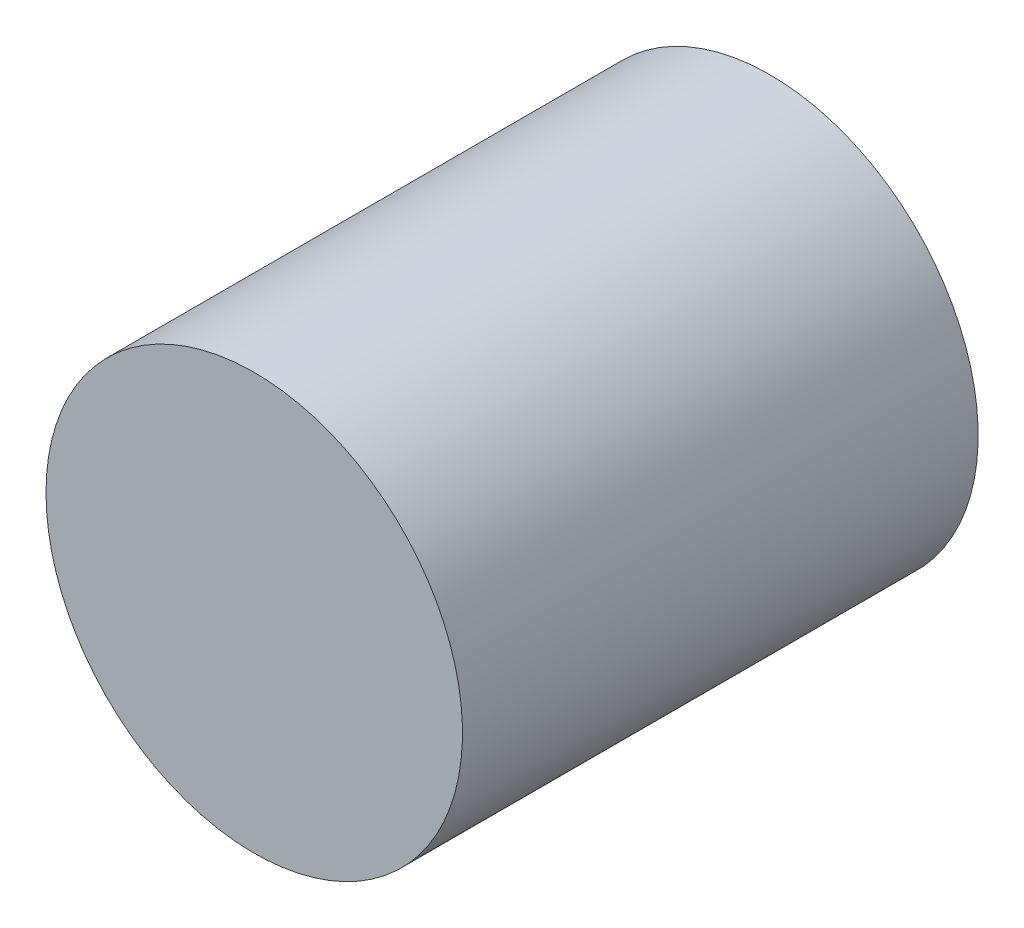
ISO-10303-21;
HEADER;
FILE_DESCRIPTION(('STEP AP214'),'2;1');
FILE_NAME('part.step','',(''),(''),'','','');
FILE_SCHEMA(('AUTOMOTIVE_DESIGN { 1 0 10303 214 1 1 1 1 }'));
ENDSEC;
DATA;
#1=APPLICATION_CONTEXT('core data for automotive mechanical design processes');
#2=APPLICATION_PROTOCOL_DEFINITION('international standard','automotive_design',2000,#1);
#3=PRODUCT_CONTEXT('',#1,'mechanical');
#4=PRODUCT('Part','Part','',(#3));
#5=PRODUCT_RELATED_PRODUCT_CATEGORY('part','',(#4));
#6=PRODUCT_DEFINITION_FORMATION('','',#4);
#7=PRODUCT_DEFINITION_CONTEXT('part definition',#1,'design');
#8=PRODUCT_DEFINITION('design','',#6,#7);
#9=PRODUCT_DEFINITION_SHAPE('','',#8);
#10=(LENGTH_UNIT() NAMED_UNIT(*) SI_UNIT(.MILLI.,.METRE.));
#11=(NAMED_UNIT(*) PLANE_ANGLE_UNIT() SI_UNIT($,.RADIAN.));
#12=(NAMED_UNIT(*) SI_UNIT($,.STERADIAN.) SOLID_ANGLE_UNIT());
#13=UNCERTAINTY_MEASURE_WITH_UNIT(LENGTH_MEASURE(1.E-05),#10,'distance_accuracy_value','');
#14=(GEOMETRIC_REPRESENTATION_CONTEXT(3) GLOBAL_UNCERTAINTY_ASSIGNED_CONTEXT((#13)) GLOBAL_UNIT_ASSIGNED_CONTEXT((#10,
#11,#12)) REPRESENTATION_CONTEXT('',''));
#15=CARTESIAN_POINT('',(0.,0.,0.));
#16=DIRECTION('',(0.,0.,1.));
#17=DIRECTION('',(1.,0.,0.));
#18=AXIS2_PLACEMENT_3D('',#15,#16,#17);
#19=CARTESIAN_POINT('',(0.,0.,52.));
#20=DIRECTION('',(0.,0.,-1.));
#21=DIRECTION('',(-1.,0.,0.));
#22=AXIS2_PLACEMENT_3D('',#19,#20,#21);
#23=CYLINDRICAL_SURFACE('',#22,21.);
#24=CARTESIAN_POINT('',(0.,0.,52.));
#25=DIRECTION('',(0.,0.,1.));
#26=DIRECTION('',(1.,0.,0.));
#27=AXIS2_PLACEMENT_3D('',#24,#25,#26);
#28=CIRCLE('',#27,21.);
#29=CARTESIAN_POINT('',(-21.,0.,52.));
#30=VERTEX_POINT('',#29);
#31=EDGE_CURVE('E10',#30,#30,#28,.T.);
#32=CARTESIAN_POINT('',(0.,0.,0.));
#33=DIRECTION('',(0.,0.,1.));
#34=DIRECTION('',(1.,0.,0.));
#35=AXIS2_PLACEMENT_3D('',#32,#33,#34);
#36=CIRCLE('',#35,21.);
#37=CARTESIAN_POINT('',(-21.,0.,0.));
#38=VERTEX_POINT('',#37);
#39=EDGE_CURVE('E37',#38,#38,#36,.T.);
#40=CARTESIAN_POINT('',(-21.,0.,52.));
#41=CARTESIAN_POINT('',(-21.,0.,51.4583333333333));
#42=CARTESIAN_POINT('',(-21.,0.,50.9166666666667));
#43=CARTESIAN_POINT('',(-21.,0.,49.8333333333333));
#44=CARTESIAN_POINT('',(-21.,0.,49.2916666666667));
#45=CARTESIAN_POINT('',(-21.,0.,48.2083333333333));
#46=CARTESIAN_POINT('',(-21.,0.,47.6666666666667));
#47=CARTESIAN_POINT('',(-21.,0.,46.5833333333333));
#48=CARTESIAN_POINT('',(-21.,0.,46.0416666666667));
#49=CARTESIAN_POINT('',(-21.,0.,44.9583333333333));
#50=CARTESIAN_POINT('',(-21.,0.,44.4166666666667));
#51=CARTESIAN_POINT('',(-21.,0.,43.3333333333333));
#52=CARTESIAN_POINT('',(-21.,0.,42.7916666666667));
#53=CARTESIAN_POINT('',(-21.,0.,41.7083333333333));
#54=CARTESIAN_POINT('',(-21.,0.,41.1666666666667));
#55=CARTESIAN_POINT('',(-21.,0.,40.0833333333333));
#56=CARTESIAN_POINT('',(-21.,0.,39.5416666666667));
#57=CARTESIAN_POINT('',(-21.,0.,38.4583333333333));
#58=CARTESIAN_POINT('',(-21.,0.,37.9166666666667));
#59=CARTESIAN_POINT('',(-21.,0.,36.8333333333333));
#60=CARTESIAN_POINT('',(-21.,0.,36.2916666666667));
#61=CARTESIAN_POINT('',(-21.,0.,35.2083333333333));
#62=CARTESIAN_POINT('',(-21.,0.,34.6666666666667));
#63=CARTESIAN_POINT('',(-21.,0.,33.5833333333333));
#64=CARTESIAN_POINT('',(-21.,0.,33.0416666666667));
#65=CARTESIAN_POINT('',(-21.,0.,31.9583333333333));
#66=CARTESIAN_POINT('',(-21.,0.,31.4166666666667));
#67=CARTESIAN_POINT('',(-21.,0.,30.3333333333333));
#68=CARTESIAN_POINT('',(-21.,0.,29.7916666666667));
#69=CARTESIAN_POINT('',(-21.,0.,28.7083333333333));
#70=CARTESIAN_POINT('',(-21.,0.,28.1666666666667));
#71=CARTESIAN_POINT('',(-21.,0.,27.0833333333333));
#72=CARTESIAN_POINT('',(-21.,0.,26.5416666666667));
#73=CARTESIAN_POINT('',(-21.,0.,25.4583333333333));
#74=CARTESIAN_POINT('',(-21.,0.,24.9166666666667));
#75=CARTESIAN_POINT('',(-21.,0.,23.8333333333333));
#76=CARTESIAN_POINT('',(-21.,0.,23.2916666666667));
#77=CARTESIAN_POINT('',(-21.,0.,22.2083333333333));
#78=CARTESIAN_POINT('',(-21.,0.,21.6666666666667));
#79=CARTESIAN_POINT('',(-21.,0.,20.5833333333333));
#80=CARTESIAN_POINT('',(-21.,0.,20.0416666666667));
#81=CARTESIAN_POINT('',(-21.,0.,18.9583333333333));
#82=CARTESIAN_POINT('',(-21.,0.,18.4166666666667));
#83=CARTESIAN_POINT('',(-21.,0.,17.3333333333333));
#84=CARTESIAN_POINT('',(-21.,0.,16.7916666666667));
#85=CARTESIAN_POINT('',(-21.,0.,15.7083333333333));
#86=CARTESIAN_POINT('',(-21.,0.,15.1666666666667));
#87=CARTESIAN_POINT('',(-21.,0.,14.0833333333333));
#88=CARTESIAN_POINT('',(-21.,0.,13.5416666666667));
#89=CARTESIAN_POINT('',(-21.,0.,12.4583333333333));
#90=CARTESIAN_POINT('',(-21.,0.,11.9166666666667));
#91=CARTESIAN_POINT('',(-21.,0.,10.8333333333333));
#92=CARTESIAN_POINT('',(-21.,0.,10.2916666666667));
#93=CARTESIAN_POINT('',(-21.,0.,9.20833333333333));
#94=CARTESIAN_POINT('',(-21.,0.,8.66666666666667));
#95=CARTESIAN_POINT('',(-21.,0.,7.58333333333333));
#96=CARTESIAN_POINT('',(-21.,0.,7.04166666666667));
#97=CARTESIAN_POINT('',(-21.,0.,5.95833333333333));
#98=CARTESIAN_POINT('',(-21.,0.,5.41666666666667));
#99=CARTESIAN_POINT('',(-21.,0.,4.33333333333333));
#100=CARTESIAN_POINT('',(-21.,0.,3.79166666666667));
#101=CARTESIAN_POINT('',(-21.,0.,2.70833333333334));
#102=CARTESIAN_POINT('',(-21.,0.,2.16666666666667));
#103=CARTESIAN_POINT('',(-21.,0.,1.08333333333333));
#104=CARTESIAN_POINT('',(-21.,0.,0.541666666666667));
#105=CARTESIAN_POINT('',(-21.,0.,0.));
#106=B_SPLINE_CURVE_WITH_KNOTS('',3,(#40,#41,#42,#43,#44,#45,#46,#47,#48,#49,#50,#51,#52,#53,
#54,#55,#56,#57,#58,#59,#60,#61,#62,#63,#64,#65,#66,#67,#68,#69,#70,#71,#72,#73,#74,#75,#76,#77,
#78,#79,#80,#81,#82,#83,#84,#85,#86,#87,#88,#89,#90,#91,#92,#93,#94,#95,#96,#97,#98,#99,#100,
#101,#102,#103,#104,#105),.UNSPECIFIED.,.F.,.F.,(4,2,2,2,2,2,2,2,2,2,2,2,2,2,2,2,2,2,2,2,2,2,2,
2,2,2,2,2,2,2,2,2,4),(0.,1.625,3.25,4.875,6.50000000000001,8.125,9.75,11.375,13.,14.625,16.25,
17.875,19.5,21.125,22.75,24.375,26.,27.625,29.25,30.875,32.5,34.125,35.75,37.375,39.,40.625,
42.25,43.875,45.5,47.125,48.75,50.375,52.),.UNSPECIFIED.);
#107=EDGE_CURVE('BSEAM34',#30,#38,#106,.T.);
#108=ORIENTED_EDGE('',*,*,#31,.F.);
#109=ORIENTED_EDGE('',*,*,#39,.T.);
#110=ORIENTED_EDGE('',*,*,#107,.T.);
#111=ORIENTED_EDGE('',*,*,#107,.F.);
#112=EDGE_LOOP('',(#108,#110,#109,#111));
#113=FACE_BOUND('',#112,.T.);
#114=ADVANCED_FACE('F34',(#113),#23,.T.);
#115=CARTESIAN_POINT('',(0.,0.,52.));
#116=DIRECTION('',(0.,0.,1.));
#117=DIRECTION('',(1.,0.,0.));
#118=AXIS2_PLACEMENT_3D('',#115,#116,#117);
#119=PLANE('',#118);
#120=ORIENTED_EDGE('',*,*,#31,.T.);
#121=EDGE_LOOP('',(#120));
#122=FACE_BOUND('',#121,.T.);
#123=ADVANCED_FACE('F76',(#122),#119,.T.);
#124=CARTESIAN_POINT('',(0.,0.,0.));
#125=DIRECTION('',(0.,0.,1.));
#126=DIRECTION('',(1.,0.,0.));
#127=AXIS2_PLACEMENT_3D('',#124,#125,#126);
#128=PLANE('',#127);
#129=CARTESIAN_POINT('',(-12.3408620039273,-7.12500000000053,0.));
#130=DIRECTION('',(0.,0.,1.));
#131=DIRECTION('',(1.,0.,0.));
#132=AXIS2_PLACEMENT_3D('',#129,#130,#131);
#133=CIRCLE('',#132,2.00000000000115);
#134=CARTESIAN_POINT('',(-10.3408620039262,-7.12500000000053,0.));
#135=VERTEX_POINT('',#134);
#136=EDGE_CURVE('E58',#135,#135,#133,.T.);
#137=ORIENTED_EDGE('',*,*,#136,.T.);
#138=EDGE_LOOP('',(#137));
#139=FACE_BOUND('',#138,.T.);
#140=CARTESIAN_POINT('',(12.3408620039292,-7.12499999999948,0.));
#141=DIRECTION('',(0.,0.,1.));
#142=DIRECTION('',(1.,0.,0.));
#143=AXIS2_PLACEMENT_3D('',#140,#141,#142);
#144=CIRCLE('',#143,2.00000000000078);
#145=CARTESIAN_POINT('',(14.3408620039299,-7.12499999999948,0.));
#146=VERTEX_POINT('',#145);
#147=EDGE_CURVE('E52',#146,#146,#144,.T.);
#148=ORIENTED_EDGE('',*,*,#147,.T.);
#149=EDGE_LOOP('',(#148));
#150=FACE_BOUND('',#149,.T.);
#151=CARTESIAN_POINT('',(0.,14.25,0.));
#152=DIRECTION('',(0.,0.,1.));
#153=DIRECTION('',(1.,0.,0.));
#154=AXIS2_PLACEMENT_3D('',#151,#152,#153);
#155=CIRCLE('',#154,2.);
#156=CARTESIAN_POINT('',(2.,14.25,0.));
#157=VERTEX_POINT('',#156);
#158=EDGE_CURVE('E46',#157,#157,#155,.T.);
#159=ORIENTED_EDGE('',*,*,#158,.T.);
#160=EDGE_LOOP('',(#159));
#161=FACE_BOUND('',#160,.T.);
#162=ORIENTED_EDGE('',*,*,#39,.F.);
#163=EDGE_LOOP('',(#162));
#164=FACE_BOUND('',#163,.T.);
#165=ADVANCED_FACE('F81',(#139,#150,#161,#164),#128,.F.);
#166=CARTESIAN_POINT('',(0.,14.25,-2.5));
#167=DIRECTION('',(0.,0.,1.));
#168=DIRECTION('',(1.,0.,0.));
#169=AXIS2_PLACEMENT_3D('',#166,#167,#168);
#170=CYLINDRICAL_SURFACE('',#169,2.);
#171=CARTESIAN_POINT('',(0.,14.25,-2.5));
#172=DIRECTION('',(0.,0.,1.));
#173=DIRECTION('',(1.,0.,0.));
#174=AXIS2_PLACEMENT_3D('',#171,#172,#173);
#175=CIRCLE('',#174,2.);
#176=CARTESIAN_POINT('',(2.,14.25,-2.5));
#177=VERTEX_POINT('',#176);
#178=EDGE_CURVE('E44',#177,#177,#175,.T.);
#179=ORIENTED_EDGE('',*,*,#178,.T.);
#180=EDGE_LOOP('',(#179));
#181=FACE_BOUND('',#180,.T.);
#182=ORIENTED_EDGE('',*,*,#158,.F.);
#183=EDGE_LOOP('',(#182));
#184=FACE_BOUND('',#183,.T.);
#185=ADVANCED_FACE('F87',(#181,#184),#170,.T.);
#186=CARTESIAN_POINT('',(0.,14.25,-2.5));
#187=DIRECTION('',(0.,0.,1.));
#188=DIRECTION('',(1.,0.,0.));
#189=AXIS2_PLACEMENT_3D('',#186,#187,#188);
#190=PLANE('',#189);
#191=ORIENTED_EDGE('',*,*,#178,.F.);
#192=EDGE_LOOP('',(#191));
#193=FACE_BOUND('',#192,.T.);
#194=ADVANCED_FACE('F92',(#193),#190,.F.);
#195=CARTESIAN_POINT('',(12.3408620039292,-7.12499999999948,-2.5));
#196=DIRECTION('',(0.,0.,1.));
#197=DIRECTION('',(1.,0.,0.));
#198=AXIS2_PLACEMENT_3D('',#195,#196,#197);
#199=CYLINDRICAL_SURFACE('',#198,2.00000000000078);
#200=CARTESIAN_POINT('',(12.3408620039292,-7.12499999999948,-2.5));
#201=DIRECTION('',(0.,0.,1.));
#202=DIRECTION('',(1.,0.,0.));
#203=AXIS2_PLACEMENT_3D('',#200,#201,#202);
#204=CIRCLE('',#203,2.00000000000078);
#205=CARTESIAN_POINT('',(14.3408620039299,-7.12499999999948,-2.5));
#206=VERTEX_POINT('',#205);
#207=EDGE_CURVE('E49',#206,#206,#204,.T.);
#208=ORIENTED_EDGE('',*,*,#207,.T.);
#209=EDGE_LOOP('',(#208));
#210=FACE_BOUND('',#209,.T.);
#211=ORIENTED_EDGE('',*,*,#147,.F.);
#212=EDGE_LOOP('',(#211));
#213=FACE_BOUND('',#212,.T.);
#214=ADVANCED_FACE('F99',(#210,#213),#199,.T.);
#215=CARTESIAN_POINT('',(12.3408620039292,-7.12499999999948,-2.5));
#216=DIRECTION('',(0.,0.,1.));
#217=DIRECTION('',(1.,0.,0.));
#218=AXIS2_PLACEMENT_3D('',#215,#216,#217);
#219=PLANE('',#218);
#220=ORIENTED_EDGE('',*,*,#207,.F.);
#221=EDGE_LOOP('',(#220));
#222=FACE_BOUND('',#221,.T.);
#223=ADVANCED_FACE('F73',(#222),#219,.F.);
#224=CARTESIAN_POINT('',(-12.3408620039273,-7.12500000000053,-2.5));
#225=DIRECTION('',(0.,0.,1.));
#226=DIRECTION('',(1.,0.,0.));
#227=AXIS2_PLACEMENT_3D('',#224,#225,#226);
#228=CYLINDRICAL_SURFACE('',#227,2.00000000000115);
#229=CARTESIAN_POINT('',(-12.3408620039273,-7.12500000000053,-2.5));
#230=DIRECTION('',(0.,0.,1.));
#231=DIRECTION('',(1.,0.,0.));
#232=AXIS2_PLACEMENT_3D('',#229,#230,#231);
#233=CIRCLE('',#232,2.00000000000115);
#234=CARTESIAN_POINT('',(-10.3408620039262,-7.12500000000053,-2.5));
#235=VERTEX_POINT('',#234);
#236=EDGE_CURVE('E55',#235,#235,#233,.T.);
#237=ORIENTED_EDGE('',*,*,#236,.T.);
#238=EDGE_LOOP('',(#237));
#239=FACE_BOUND('',#238,.T.);
#240=ORIENTED_EDGE('',*,*,#136,.F.);
#241=EDGE_LOOP('',(#240));
#242=FACE_BOUND('',#241,.T.);
#243=ADVANCED_FACE('F64',(#239,#242),#228,.T.);
#244=CARTESIAN_POINT('',(-12.3408620039273,-7.12500000000053,-2.5));
#245=DIRECTION('',(0.,0.,1.));
#246=DIRECTION('',(1.,0.,0.));
#247=AXIS2_PLACEMENT_3D('',#244,#245,#246);
#248=PLANE('',#247);
#249=ORIENTED_EDGE('',*,*,#236,.F.);
#250=EDGE_LOOP('',(#249));
#251=FACE_BOUND('',#250,.T.);
#252=ADVANCED_FACE('F67',(#251),#248,.F.);
#253=CLOSED_SHELL('',(#114,#123,#165,#185,#194,#214,#223,#243,#252));
#254=MANIFOLD_SOLID_BREP('B2',#253);
#255=ADVANCED_BREP_SHAPE_REPRESENTATION('',(#18,#254),#14);
#256=SHAPE_DEFINITION_REPRESENTATION(#9,#255);
ENDSEC;
END-ISO-10303-21;
